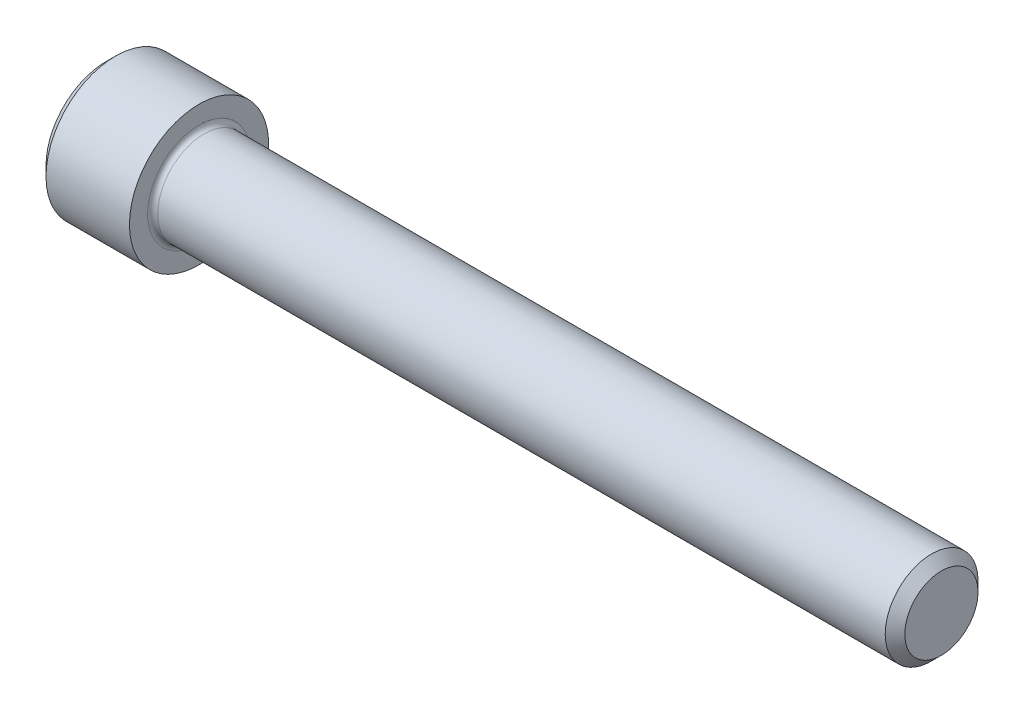
ISO-10303-21;
HEADER;
FILE_DESCRIPTION(('STEP AP214'),'2;1');
FILE_NAME('part.step','',(''),(''),'','','');
FILE_SCHEMA(('AUTOMOTIVE_DESIGN { 1 0 10303 214 1 1 1 1 }'));
ENDSEC;
DATA;
#1=APPLICATION_CONTEXT('core data for automotive mechanical design processes');
#2=APPLICATION_PROTOCOL_DEFINITION('international standard','automotive_design',2000,#1);
#3=PRODUCT_CONTEXT('',#1,'mechanical');
#4=PRODUCT('Part','Part','',(#3));
#5=PRODUCT_RELATED_PRODUCT_CATEGORY('part','',(#4));
#6=PRODUCT_DEFINITION_FORMATION('','',#4);
#7=PRODUCT_DEFINITION_CONTEXT('part definition',#1,'design');
#8=PRODUCT_DEFINITION('design','',#6,#7);
#9=PRODUCT_DEFINITION_SHAPE('','',#8);
#10=(LENGTH_UNIT() NAMED_UNIT(*) SI_UNIT(.MILLI.,.METRE.));
#11=(NAMED_UNIT(*) PLANE_ANGLE_UNIT() SI_UNIT($,.RADIAN.));
#12=(NAMED_UNIT(*) SI_UNIT($,.STERADIAN.) SOLID_ANGLE_UNIT());
#13=UNCERTAINTY_MEASURE_WITH_UNIT(LENGTH_MEASURE(1.E-05),#10,'distance_accuracy_value','');
#14=(GEOMETRIC_REPRESENTATION_CONTEXT(3) GLOBAL_UNCERTAINTY_ASSIGNED_CONTEXT((#13)) GLOBAL_UNIT_ASSIGNED_CONTEXT((#10,
#11,#12)) REPRESENTATION_CONTEXT('',''));
#15=CARTESIAN_POINT('',(0.,0.,0.));
#16=DIRECTION('',(0.,0.,1.));
#17=DIRECTION('',(1.,0.,0.));
#18=AXIS2_PLACEMENT_3D('',#15,#16,#17);
#19=CARTESIAN_POINT('',(0.,0.,0.));
#20=DIRECTION('',(-1.,0.,0.));
#21=DIRECTION('',(0.,0.,1.));
#22=AXIS2_PLACEMENT_3D('',#19,#20,#21);
#23=PLANE('',#22);
#24=DIRECTION('',(0.,-0.499999999999999,0.86602540378444));
#25=VECTOR('',#24,1.);
#26=CARTESIAN_POINT('',(0.,3.66617420935413,0.));
#27=LINE('',#26,#25);
#28=CARTESIAN_POINT('',(0.,3.66617420935413,0.));
#29=VERTEX_POINT('',#28);
#30=CARTESIAN_POINT('',(0.,1.83308710467707,3.17499999999999));
#31=VERTEX_POINT('',#30);
#32=EDGE_CURVE('E377',#29,#31,#27,.T.);
#33=ORIENTED_EDGE('',*,*,#32,.T.);
#34=DIRECTION('',(0.,1.,0.));
#35=VECTOR('',#34,1.);
#36=CARTESIAN_POINT('',(0.,-1.83308710467705,3.175));
#37=LINE('',#36,#35);
#38=CARTESIAN_POINT('',(0.,-1.83308710467705,3.175));
#39=VERTEX_POINT('',#38);
#40=EDGE_CURVE('E125',#39,#31,#37,.T.);
#41=ORIENTED_EDGE('',*,*,#40,.F.);
#42=DIRECTION('',(0.,-0.500000000000001,-0.866025403784438));
#43=VECTOR('',#42,1.);
#44=CARTESIAN_POINT('',(0.,-1.83308710467705,3.175));
#45=LINE('',#44,#43);
#46=CARTESIAN_POINT('',(0.,-3.66617420935412,0.));
#47=VERTEX_POINT('',#46);
#48=EDGE_CURVE('E380',#39,#47,#45,.T.);
#49=ORIENTED_EDGE('',*,*,#48,.T.);
#50=DIRECTION('',(0.,0.499999999999998,-0.86602540378444));
#51=VECTOR('',#50,1.);
#52=CARTESIAN_POINT('',(0.,-3.66617420935412,0.));
#53=LINE('',#52,#51);
#54=CARTESIAN_POINT('',(0.,-1.83308710467706,-3.175));
#55=VERTEX_POINT('',#54);
#56=EDGE_CURVE('E383',#47,#55,#53,.T.);
#57=ORIENTED_EDGE('',*,*,#56,.T.);
#58=DIRECTION('',(0.,-1.,0.));
#59=VECTOR('',#58,1.);
#60=CARTESIAN_POINT('',(0.,1.83308710467706,-3.175));
#61=LINE('',#60,#59);
#62=CARTESIAN_POINT('',(0.,1.83308710467706,-3.175));
#63=VERTEX_POINT('',#62);
#64=EDGE_CURVE('E386',#63,#55,#61,.T.);
#65=ORIENTED_EDGE('',*,*,#64,.F.);
#66=DIRECTION('',(0.,-0.500000000000001,-0.866025403784438));
#67=VECTOR('',#66,1.);
#68=CARTESIAN_POINT('',(0.,3.66617420935413,0.));
#69=LINE('',#68,#67);
#70=EDGE_CURVE('E120',#29,#63,#69,.T.);
#71=ORIENTED_EDGE('',*,*,#70,.F.);
#72=EDGE_LOOP('',(#33,#41,#49,#57,#65,#71));
#73=FACE_BOUND('',#72,.T.);
#74=CARTESIAN_POINT('',(0.,0.,0.));
#75=DIRECTION('',(-1.,0.,0.));
#76=DIRECTION('',(0.,0.,1.));
#77=AXIS2_PLACEMENT_3D('',#74,#75,#76);
#78=CIRCLE('',#77,5.15366);
#79=CARTESIAN_POINT('',(0.,0.,5.15366));
#80=VERTEX_POINT('',#79);
#81=EDGE_CURVE('E136',#80,#80,#78,.T.);
#82=ORIENTED_EDGE('',*,*,#81,.T.);
#83=EDGE_LOOP('',(#82));
#84=FACE_BOUND('',#83,.T.);
#85=ADVANCED_FACE('F33',(#73,#84),#23,.T.);
#86=CARTESIAN_POINT('',(71.4375,3.12928,0.));
#87=DIRECTION('',(1.,0.,0.));
#88=DIRECTION('',(0.,0.,-1.));
#89=AXIS2_PLACEMENT_3D('',#86,#87,#88);
#90=PLANE('',#89);
#91=CARTESIAN_POINT('',(71.4375,0.,0.));
#92=DIRECTION('',(-1.,0.,0.));
#93=DIRECTION('',(0.,0.,1.));
#94=AXIS2_PLACEMENT_3D('',#91,#92,#93);
#95=CIRCLE('',#94,3.12928);
#96=CARTESIAN_POINT('',(71.4375,0.,3.12928));
#97=VERTEX_POINT('',#96);
#98=EDGE_CURVE('E149',#97,#97,#95,.T.);
#99=ORIENTED_EDGE('',*,*,#98,.F.);
#100=EDGE_LOOP('',(#99));
#101=FACE_BOUND('',#100,.T.);
#102=ADVANCED_FACE('F170',(#101),#90,.T.);
#103=CARTESIAN_POINT('',(71.4375,0.,0.));
#104=DIRECTION('',(-1.,0.,0.));
#105=DIRECTION('',(0.,0.,1.));
#106=AXIS2_PLACEMENT_3D('',#103,#104,#105);
#107=CONICAL_SURFACE('',#106,3.12928,0.7853981633974);
#108=CARTESIAN_POINT('',(70.59803,0.,0.));
#109=DIRECTION('',(-1.,0.,0.));
#110=DIRECTION('',(0.,0.,1.));
#111=AXIS2_PLACEMENT_3D('',#108,#109,#110);
#112=CIRCLE('',#111,3.96874999999994);
#113=CARTESIAN_POINT('',(70.59803,0.,3.96874999999994));
#114=VERTEX_POINT('',#113);
#115=EDGE_CURVE('E146',#114,#114,#112,.T.);
#116=ORIENTED_EDGE('',*,*,#115,.F.);
#117=EDGE_LOOP('',(#116));
#118=FACE_BOUND('',#117,.T.);
#119=ORIENTED_EDGE('',*,*,#98,.T.);
#120=EDGE_LOOP('',(#119));
#121=FACE_BOUND('',#120,.T.);
#122=ADVANCED_FACE('F176',(#118,#121),#107,.T.);
#123=CARTESIAN_POINT('',(-31.75,0.,0.));
#124=DIRECTION('',(-1.,0.,0.));
#125=DIRECTION('',(0.,0.,1.));
#126=AXIS2_PLACEMENT_3D('',#123,#124,#125);
#127=CYLINDRICAL_SURFACE('',#126,3.96874999999997);
#128=CARTESIAN_POINT('',(8.3693,0.,0.));
#129=DIRECTION('',(1.,0.,0.));
#130=DIRECTION('',(0.,0.,-1.));
#131=AXIS2_PLACEMENT_3D('',#128,#129,#130);
#132=CIRCLE('',#131,3.96874999999997);
#133=CARTESIAN_POINT('',(8.3693,0.,-3.96874999999997));
#134=VERTEX_POINT('',#133);
#135=EDGE_CURVE('E11',#134,#134,#132,.T.);
#136=ORIENTED_EDGE('',*,*,#135,.T.);
#137=EDGE_LOOP('',(#136));
#138=FACE_BOUND('',#137,.T.);
#139=ORIENTED_EDGE('',*,*,#115,.T.);
#140=EDGE_LOOP('',(#139));
#141=FACE_BOUND('',#140,.T.);
#142=ADVANCED_FACE('F187',(#138,#141),#127,.T.);
#143=CARTESIAN_POINT('',(7.9375,5.95376,0.));
#144=DIRECTION('',(1.,0.,0.));
#145=DIRECTION('',(0.,0.,-1.));
#146=AXIS2_PLACEMENT_3D('',#143,#144,#145);
#147=PLANE('',#146);
#148=CARTESIAN_POINT('',(7.9375,0.,0.));
#149=DIRECTION('',(1.,0.,0.));
#150=DIRECTION('',(0.,0.,-1.));
#151=AXIS2_PLACEMENT_3D('',#148,#149,#150);
#152=CIRCLE('',#151,4.40054999999997);
#153=CARTESIAN_POINT('',(7.9375,0.,-4.40054999999997));
#154=VERTEX_POINT('',#153);
#155=EDGE_CURVE('E41',#154,#154,#152,.F.);
#156=ORIENTED_EDGE('',*,*,#155,.T.);
#157=EDGE_LOOP('',(#156));
#158=FACE_BOUND('',#157,.T.);
#159=CARTESIAN_POINT('',(7.9375,0.,0.));
#160=DIRECTION('',(-1.,0.,0.));
#161=DIRECTION('',(0.,0.,1.));
#162=AXIS2_PLACEMENT_3D('',#159,#160,#161);
#163=CIRCLE('',#162,5.95376);
#164=CARTESIAN_POINT('',(7.9375,0.,5.95376));
#165=VERTEX_POINT('',#164);
#166=EDGE_CURVE('E143',#165,#165,#163,.T.);
#167=ORIENTED_EDGE('',*,*,#166,.F.);
#168=EDGE_LOOP('',(#167));
#169=FACE_BOUND('',#168,.T.);
#170=ADVANCED_FACE('F154',(#158,#169),#147,.T.);
#171=CARTESIAN_POINT('',(-31.75,0.,0.));
#172=DIRECTION('',(-1.,0.,0.));
#173=DIRECTION('',(0.,0.,1.));
#174=AXIS2_PLACEMENT_3D('',#171,#172,#173);
#175=CYLINDRICAL_SURFACE('',#174,5.95376);
#176=ORIENTED_EDGE('',*,*,#166,.T.);
#177=EDGE_LOOP('',(#176));
#178=FACE_BOUND('',#177,.T.);
#179=CARTESIAN_POINT('',(0.800099999999998,0.,0.));
#180=DIRECTION('',(-1.,0.,0.));
#181=DIRECTION('',(0.,0.,1.));
#182=AXIS2_PLACEMENT_3D('',#179,#180,#181);
#183=CIRCLE('',#182,5.95376);
#184=CARTESIAN_POINT('',(0.800099999999998,0.,5.95376));
#185=VERTEX_POINT('',#184);
#186=EDGE_CURVE('E140',#185,#185,#183,.T.);
#187=ORIENTED_EDGE('',*,*,#186,.F.);
#188=EDGE_LOOP('',(#187));
#189=FACE_BOUND('',#188,.T.);
#190=ADVANCED_FACE('F165',(#178,#189),#175,.T.);
#191=CARTESIAN_POINT('',(0.,0.,0.));
#192=DIRECTION('',(1.,0.,0.));
#193=DIRECTION('',(0.,0.,-1.));
#194=AXIS2_PLACEMENT_3D('',#191,#192,#193);
#195=CONICAL_SURFACE('',#194,5.15366,0.785398163397449);
#196=ORIENTED_EDGE('',*,*,#186,.T.);
#197=EDGE_LOOP('',(#196));
#198=FACE_BOUND('',#197,.T.);
#199=ORIENTED_EDGE('',*,*,#81,.F.);
#200=EDGE_LOOP('',(#199));
#201=FACE_BOUND('',#200,.T.);
#202=ADVANCED_FACE('F158',(#198,#201),#195,.T.);
#203=CARTESIAN_POINT('',(8.3693,0.,0.));
#204=DIRECTION('',(1.,0.,0.));
#205=DIRECTION('',(0.,0.,-1.));
#206=AXIS2_PLACEMENT_3D('',#203,#204,#205);
#207=TOROIDAL_SURFACE('',#206,4.40054999999997,0.4318);
#208=ORIENTED_EDGE('',*,*,#135,.F.);
#209=EDGE_LOOP('',(#208));
#210=FACE_BOUND('',#209,.T.);
#211=ORIENTED_EDGE('',*,*,#155,.F.);
#212=EDGE_LOOP('',(#211));
#213=FACE_BOUND('',#212,.T.);
#214=ADVANCED_FACE('F35',(#210,#213),#207,.F.);
#215=CARTESIAN_POINT('',(3.8354,3.66617420935413,0.));
#216=DIRECTION('',(0.,-0.866025403784439,-0.499999999999999));
#217=DIRECTION('',(0.,0.499999999999999,-0.866025403784439));
#218=AXIS2_PLACEMENT_3D('',#215,#216,#217);
#219=PLANE('',#218);
#220=ORIENTED_EDGE('',*,*,#32,.F.);
#221=DIRECTION('',(-1.,0.,0.));
#222=VECTOR('',#221,1.);
#223=CARTESIAN_POINT('',(3.8354,3.66617420935413,0.));
#224=LINE('',#223,#222);
#225=CARTESIAN_POINT('',(3.8354,3.66617420935413,0.));
#226=VERTEX_POINT('',#225);
#227=EDGE_CURVE('E376',#226,#29,#224,.T.);
#228=ORIENTED_EDGE('',*,*,#227,.F.);
#229=DIRECTION('',(0.,-0.499999999999999,0.86602540378444));
#230=VECTOR('',#229,1.);
#231=CARTESIAN_POINT('',(3.8354,3.66617420935413,0.));
#232=LINE('',#231,#230);
#233=CARTESIAN_POINT('',(3.8354,2.7496306570156,1.5875));
#234=VERTEX_POINT('',#233);
#235=EDGE_CURVE('E48',#226,#234,#232,.T.);
#236=ORIENTED_EDGE('',*,*,#235,.T.);
#237=CARTESIAN_POINT('',(3.8354,1.83308710467707,3.17499999999999));
#238=VERTEX_POINT('',#237);
#239=EDGE_CURVE('E106',#234,#238,#232,.T.);
#240=ORIENTED_EDGE('',*,*,#239,.T.);
#241=DIRECTION('',(-1.,0.,0.));
#242=VECTOR('',#241,1.);
#243=CARTESIAN_POINT('',(3.8354,1.83308710467707,3.17499999999999));
#244=LINE('',#243,#242);
#245=EDGE_CURVE('E118',#238,#31,#244,.T.);
#246=ORIENTED_EDGE('',*,*,#245,.T.);
#247=EDGE_LOOP('',(#220,#228,#236,#240,#246));
#248=FACE_BOUND('',#247,.T.);
#249=ADVANCED_FACE('F117',(#248),#219,.T.);
#250=CARTESIAN_POINT('',(3.8354,-1.83308710467705,3.175));
#251=DIRECTION('',(0.,0.,1.));
#252=DIRECTION('',(0.,-1.,0.));
#253=AXIS2_PLACEMENT_3D('',#250,#251,#252);
#254=PLANE('',#253);
#255=ORIENTED_EDGE('',*,*,#40,.T.);
#256=ORIENTED_EDGE('',*,*,#245,.F.);
#257=DIRECTION('',(0.,1.,0.));
#258=VECTOR('',#257,1.);
#259=CARTESIAN_POINT('',(3.8354,-1.83308710467705,3.175));
#260=LINE('',#259,#258);
#261=CARTESIAN_POINT('',(3.8354,0.,3.175));
#262=VERTEX_POINT('',#261);
#263=EDGE_CURVE('E104',#262,#238,#260,.T.);
#264=ORIENTED_EDGE('',*,*,#263,.F.);
#265=CARTESIAN_POINT('',(3.8354,-1.83308710467705,3.175));
#266=VERTEX_POINT('',#265);
#267=EDGE_CURVE('E114',#266,#262,#260,.T.);
#268=ORIENTED_EDGE('',*,*,#267,.F.);
#269=DIRECTION('',(-1.,0.,0.));
#270=VECTOR('',#269,1.);
#271=CARTESIAN_POINT('',(3.8354,-1.83308710467705,3.175));
#272=LINE('',#271,#270);
#273=EDGE_CURVE('E127',#266,#39,#272,.T.);
#274=ORIENTED_EDGE('',*,*,#273,.T.);
#275=EDGE_LOOP('',(#255,#256,#264,#268,#274));
#276=FACE_BOUND('',#275,.T.);
#277=ADVANCED_FACE('F122',(#276),#254,.F.);
#278=CARTESIAN_POINT('',(3.8354,-1.83308710467705,3.175));
#279=DIRECTION('',(0.,0.866025403784438,-0.500000000000001));
#280=DIRECTION('',(0.,0.500000000000001,0.866025403784438));
#281=AXIS2_PLACEMENT_3D('',#278,#279,#280);
#282=PLANE('',#281);
#283=ORIENTED_EDGE('',*,*,#48,.F.);
#284=ORIENTED_EDGE('',*,*,#273,.F.);
#285=DIRECTION('',(0.,-0.500000000000001,-0.866025403784438));
#286=VECTOR('',#285,1.);
#287=CARTESIAN_POINT('',(3.8354,-1.83308710467705,3.175));
#288=LINE('',#287,#286);
#289=CARTESIAN_POINT('',(3.8354,-2.74963065701558,1.5875));
#290=VERTEX_POINT('',#289);
#291=EDGE_CURVE('E357',#266,#290,#288,.T.);
#292=ORIENTED_EDGE('',*,*,#291,.T.);
#293=CARTESIAN_POINT('',(3.8354,-3.66617420935412,0.));
#294=VERTEX_POINT('',#293);
#295=EDGE_CURVE('E359',#290,#294,#288,.T.);
#296=ORIENTED_EDGE('',*,*,#295,.T.);
#297=DIRECTION('',(-1.,0.,0.));
#298=VECTOR('',#297,1.);
#299=CARTESIAN_POINT('',(3.8354,-3.66617420935412,0.));
#300=LINE('',#299,#298);
#301=EDGE_CURVE('E132',#294,#47,#300,.T.);
#302=ORIENTED_EDGE('',*,*,#301,.T.);
#303=EDGE_LOOP('',(#283,#284,#292,#296,#302));
#304=FACE_BOUND('',#303,.T.);
#305=ADVANCED_FACE('F249',(#304),#282,.T.);
#306=CARTESIAN_POINT('',(3.8354,-3.66617420935412,0.));
#307=DIRECTION('',(0.,0.86602540378444,0.499999999999999));
#308=DIRECTION('',(0.,-0.499999999999998,0.866025403784439));
#309=AXIS2_PLACEMENT_3D('',#306,#307,#308);
#310=PLANE('',#309);
#311=ORIENTED_EDGE('',*,*,#56,.F.);
#312=ORIENTED_EDGE('',*,*,#301,.F.);
#313=DIRECTION('',(0.,0.499999999999998,-0.86602540378444));
#314=VECTOR('',#313,1.);
#315=CARTESIAN_POINT('',(3.8354,-3.66617420935412,0.));
#316=LINE('',#315,#314);
#317=CARTESIAN_POINT('',(3.8354,-2.74963065701559,-1.58749999999999));
#318=VERTEX_POINT('',#317);
#319=EDGE_CURVE('E362',#294,#318,#316,.T.);
#320=ORIENTED_EDGE('',*,*,#319,.T.);
#321=CARTESIAN_POINT('',(3.8354,-1.83308710467706,-3.175));
#322=VERTEX_POINT('',#321);
#323=EDGE_CURVE('E366',#318,#322,#316,.T.);
#324=ORIENTED_EDGE('',*,*,#323,.T.);
#325=DIRECTION('',(-1.,0.,0.));
#326=VECTOR('',#325,1.);
#327=CARTESIAN_POINT('',(3.8354,-1.83308710467706,-3.175));
#328=LINE('',#327,#326);
#329=EDGE_CURVE('E395',#322,#55,#328,.T.);
#330=ORIENTED_EDGE('',*,*,#329,.T.);
#331=EDGE_LOOP('',(#311,#312,#320,#324,#330));
#332=FACE_BOUND('',#331,.T.);
#333=ADVANCED_FACE('F257',(#332),#310,.T.);
#334=CARTESIAN_POINT('',(3.8354,1.83308710467706,-3.175));
#335=DIRECTION('',(0.,0.,-1.));
#336=DIRECTION('',(0.,1.,0.));
#337=AXIS2_PLACEMENT_3D('',#334,#335,#336);
#338=PLANE('',#337);
#339=ORIENTED_EDGE('',*,*,#64,.T.);
#340=ORIENTED_EDGE('',*,*,#329,.F.);
#341=DIRECTION('',(0.,-1.,0.));
#342=VECTOR('',#341,1.);
#343=CARTESIAN_POINT('',(3.8354,1.83308710467706,-3.175));
#344=LINE('',#343,#342);
#345=CARTESIAN_POINT('',(3.8354,0.,-3.175));
#346=VERTEX_POINT('',#345);
#347=EDGE_CURVE('E370',#346,#322,#344,.T.);
#348=ORIENTED_EDGE('',*,*,#347,.F.);
#349=CARTESIAN_POINT('',(3.8354,1.83308710467706,-3.175));
#350=VERTEX_POINT('',#349);
#351=EDGE_CURVE('E371',#350,#346,#344,.T.);
#352=ORIENTED_EDGE('',*,*,#351,.F.);
#353=DIRECTION('',(-1.,0.,0.));
#354=VECTOR('',#353,1.);
#355=CARTESIAN_POINT('',(3.8354,1.83308710467706,-3.175));
#356=LINE('',#355,#354);
#357=EDGE_CURVE('E392',#350,#63,#356,.T.);
#358=ORIENTED_EDGE('',*,*,#357,.T.);
#359=EDGE_LOOP('',(#339,#340,#348,#352,#358));
#360=FACE_BOUND('',#359,.T.);
#361=ADVANCED_FACE('F266',(#360),#338,.F.);
#362=CARTESIAN_POINT('',(3.8354,3.66617420935413,0.));
#363=DIRECTION('',(0.,0.866025403784438,-0.500000000000002));
#364=DIRECTION('',(0.,0.500000000000001,0.866025403784438));
#365=AXIS2_PLACEMENT_3D('',#362,#363,#364);
#366=PLANE('',#365);
#367=ORIENTED_EDGE('',*,*,#70,.T.);
#368=ORIENTED_EDGE('',*,*,#357,.F.);
#369=DIRECTION('',(0.,-0.500000000000001,-0.866025403784438));
#370=VECTOR('',#369,1.);
#371=CARTESIAN_POINT('',(3.8354,3.66617420935413,0.));
#372=LINE('',#371,#370);
#373=CARTESIAN_POINT('',(3.8354,2.74963065701559,-1.58750000000001));
#374=VERTEX_POINT('',#373);
#375=EDGE_CURVE('E374',#374,#350,#372,.T.);
#376=ORIENTED_EDGE('',*,*,#375,.F.);
#377=EDGE_CURVE('E348',#226,#374,#372,.T.);
#378=ORIENTED_EDGE('',*,*,#377,.F.);
#379=ORIENTED_EDGE('',*,*,#227,.T.);
#380=EDGE_LOOP('',(#367,#368,#376,#378,#379));
#381=FACE_BOUND('',#380,.T.);
#382=ADVANCED_FACE('F275',(#381),#366,.F.);
#383=CARTESIAN_POINT('',(3.8354,1.83308710467707,3.17499999999999));
#384=DIRECTION('',(-1.,0.,0.));
#385=DIRECTION('',(0.,0.,1.));
#386=AXIS2_PLACEMENT_3D('',#383,#384,#385);
#387=PLANE('',#386);
#388=CARTESIAN_POINT('',(3.8354,0.,0.));
#389=DIRECTION('',(-1.,0.,0.));
#390=DIRECTION('',(0.,0.,1.));
#391=AXIS2_PLACEMENT_3D('',#388,#389,#390);
#392=CIRCLE('',#391,3.175);
#393=EDGE_CURVE('E126',#290,#262,#392,.T.);
#394=ORIENTED_EDGE('',*,*,#393,.F.);
#395=ORIENTED_EDGE('',*,*,#291,.F.);
#396=ORIENTED_EDGE('',*,*,#267,.T.);
#397=EDGE_LOOP('',(#394,#395,#396));
#398=FACE_BOUND('',#397,.T.);
#399=ADVANCED_FACE('F284',(#398),#387,.T.);
#400=EDGE_CURVE('E130',#318,#290,#392,.T.);
#401=ORIENTED_EDGE('',*,*,#400,.F.);
#402=ORIENTED_EDGE('',*,*,#319,.F.);
#403=ORIENTED_EDGE('',*,*,#295,.F.);
#404=EDGE_LOOP('',(#401,#402,#403));
#405=FACE_BOUND('',#404,.T.);
#406=ADVANCED_FACE('F293',(#405),#387,.T.);
#407=EDGE_CURVE('E401',#346,#318,#392,.T.);
#408=ORIENTED_EDGE('',*,*,#407,.F.);
#409=ORIENTED_EDGE('',*,*,#347,.T.);
#410=ORIENTED_EDGE('',*,*,#323,.F.);
#411=EDGE_LOOP('',(#408,#409,#410));
#412=FACE_BOUND('',#411,.T.);
#413=ADVANCED_FACE('F302',(#412),#387,.T.);
#414=EDGE_CURVE('E351',#374,#346,#392,.T.);
#415=ORIENTED_EDGE('',*,*,#414,.F.);
#416=ORIENTED_EDGE('',*,*,#375,.T.);
#417=ORIENTED_EDGE('',*,*,#351,.T.);
#418=EDGE_LOOP('',(#415,#416,#417));
#419=FACE_BOUND('',#418,.T.);
#420=ADVANCED_FACE('F310',(#419),#387,.T.);
#421=EDGE_CURVE('E137',#234,#374,#392,.T.);
#422=ORIENTED_EDGE('',*,*,#421,.F.);
#423=ORIENTED_EDGE('',*,*,#235,.F.);
#424=ORIENTED_EDGE('',*,*,#377,.T.);
#425=EDGE_LOOP('',(#422,#423,#424));
#426=FACE_BOUND('',#425,.T.);
#427=ADVANCED_FACE('F318',(#426),#387,.T.);
#428=EDGE_CURVE('E109',#262,#234,#392,.T.);
#429=ORIENTED_EDGE('',*,*,#428,.F.);
#430=ORIENTED_EDGE('',*,*,#263,.T.);
#431=ORIENTED_EDGE('',*,*,#239,.F.);
#432=EDGE_LOOP('',(#429,#430,#431));
#433=FACE_BOUND('',#432,.T.);
#434=ADVANCED_FACE('F105',(#433),#387,.T.);
#435=CARTESIAN_POINT('',(3.8354,0.,0.));
#436=DIRECTION('',(-1.,0.,0.));
#437=DIRECTION('',(0.,0.,1.));
#438=AXIS2_PLACEMENT_3D('',#435,#436,#437);
#439=CONICAL_SURFACE('',#438,3.175,1.04719755119659);
#440=CARTESIAN_POINT('',(5.66848710467709,0.,0.));
#441=VERTEX_POINT('',#440);
#442=VERTEX_LOOP('',#441);
#443=FACE_BOUND('',#442,.T.);
#444=ORIENTED_EDGE('',*,*,#428,.T.);
#445=ORIENTED_EDGE('',*,*,#421,.T.);
#446=ORIENTED_EDGE('',*,*,#414,.T.);
#447=ORIENTED_EDGE('',*,*,#407,.T.);
#448=ORIENTED_EDGE('',*,*,#400,.T.);
#449=ORIENTED_EDGE('',*,*,#393,.T.);
#450=EDGE_LOOP('',(#444,#445,#446,#447,#448,#449));
#451=FACE_BOUND('',#450,.T.);
#452=ADVANCED_FACE('F180',(#443,#451),#439,.F.);
#453=CLOSED_SHELL('',(#85,#102,#122,#142,#170,#190,#202,#214,#249,#277,#305,#333,#361,#382,#399,
#406,#413,#420,#427,#434,#452));
#454=MANIFOLD_SOLID_BREP('B2',#453);
#455=ADVANCED_BREP_SHAPE_REPRESENTATION('',(#18,#454),#14);
#456=SHAPE_DEFINITION_REPRESENTATION(#9,#455);
ENDSEC;
END-ISO-10303-21;
